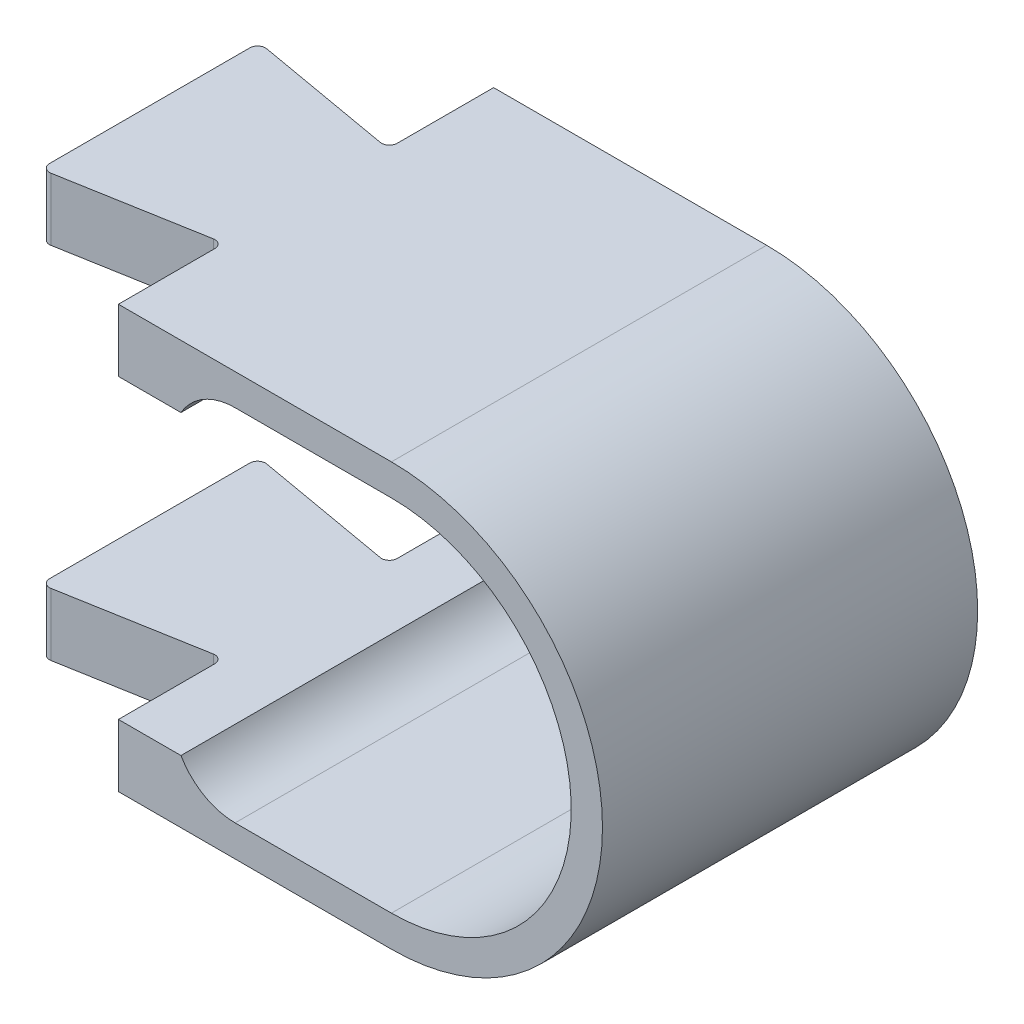
ISO-10303-21;
HEADER;
FILE_DESCRIPTION(('STEP AP214'),'2;1');
FILE_NAME('part.step','',(''),(''),'','','');
FILE_SCHEMA(('AUTOMOTIVE_DESIGN { 1 0 10303 214 1 1 1 1 }'));
ENDSEC;
DATA;
#1=APPLICATION_CONTEXT('core data for automotive mechanical design processes');
#2=APPLICATION_PROTOCOL_DEFINITION('international standard','automotive_design',2000,#1);
#3=PRODUCT_CONTEXT('',#1,'mechanical');
#4=PRODUCT('Part','Part','',(#3));
#5=PRODUCT_RELATED_PRODUCT_CATEGORY('part','',(#4));
#6=PRODUCT_DEFINITION_FORMATION('','',#4);
#7=PRODUCT_DEFINITION_CONTEXT('part definition',#1,'design');
#8=PRODUCT_DEFINITION('design','',#6,#7);
#9=PRODUCT_DEFINITION_SHAPE('','',#8);
#10=(LENGTH_UNIT() NAMED_UNIT(*) SI_UNIT(.MILLI.,.METRE.));
#11=(NAMED_UNIT(*) PLANE_ANGLE_UNIT() SI_UNIT($,.RADIAN.));
#12=(NAMED_UNIT(*) SI_UNIT($,.STERADIAN.) SOLID_ANGLE_UNIT());
#13=UNCERTAINTY_MEASURE_WITH_UNIT(LENGTH_MEASURE(1.E-05),#10,'distance_accuracy_value','');
#14=(GEOMETRIC_REPRESENTATION_CONTEXT(3) GLOBAL_UNCERTAINTY_ASSIGNED_CONTEXT((#13)) GLOBAL_UNIT_ASSIGNED_CONTEXT((#10,
#11,#12)) REPRESENTATION_CONTEXT('',''));
#15=CARTESIAN_POINT('',(0.,0.,0.));
#16=DIRECTION('',(0.,0.,1.));
#17=DIRECTION('',(1.,0.,0.));
#18=AXIS2_PLACEMENT_3D('',#15,#16,#17);
#19=CARTESIAN_POINT('',(0.,2.,0.));
#20=DIRECTION('',(0.,-1.,0.));
#21=DIRECTION('',(0.,0.,-1.));
#22=AXIS2_PLACEMENT_3D('',#19,#20,#21);
#23=PLANE('',#22);
#24=DIRECTION('',(1.,0.,0.));
#25=VECTOR('',#24,1.);
#26=CARTESIAN_POINT('',(-15.,2.,6.));
#27=LINE('',#26,#25);
#28=CARTESIAN_POINT('',(-15.,2.,6.));
#29=VERTEX_POINT('',#28);
#30=CARTESIAN_POINT('',(-13.,2.,6.));
#31=VERTEX_POINT('',#30);
#32=EDGE_CURVE('E364',#29,#31,#27,.T.);
#33=ORIENTED_EDGE('',*,*,#32,.T.);
#34=DIRECTION('',(0.,0.,1.));
#35=VECTOR('',#34,1.);
#36=CARTESIAN_POINT('',(-13.,2.,-6.));
#37=LINE('',#36,#35);
#38=CARTESIAN_POINT('',(-13.,2.,-6.));
#39=VERTEX_POINT('',#38);
#40=EDGE_CURVE('E346',#39,#31,#37,.T.);
#41=ORIENTED_EDGE('',*,*,#40,.F.);
#42=DIRECTION('',(-1.,0.,0.));
#43=VECTOR('',#42,1.);
#44=CARTESIAN_POINT('',(-15.,2.,-6.));
#45=LINE('',#44,#43);
#46=CARTESIAN_POINT('',(-15.,2.,-6.));
#47=VERTEX_POINT('',#46);
#48=EDGE_CURVE('E350',#39,#47,#45,.T.);
#49=ORIENTED_EDGE('',*,*,#48,.T.);
#50=DIRECTION('',(0.,0.,1.));
#51=VECTOR('',#50,1.);
#52=CARTESIAN_POINT('',(-15.,2.,-2.61836509645765));
#53=LINE('',#52,#51);
#54=CARTESIAN_POINT('',(-15.,2.,-2.91630349460621));
#55=VERTEX_POINT('',#54);
#56=EDGE_CURVE('E352',#47,#55,#53,.T.);
#57=ORIENTED_EDGE('',*,*,#56,.T.);
#58=CARTESIAN_POINT('',(-15.25,2.,-2.91630349460621));
#59=DIRECTION('',(0.,-1.,0.));
#60=DIRECTION('',(0.,0.,-1.));
#61=AXIS2_PLACEMENT_3D('',#58,#59,#60);
#62=CIRCLE('',#61,0.25);
#63=CARTESIAN_POINT('',(-15.2934120444167,2.,-2.67010155635316));
#64=VERTEX_POINT('',#63);
#65=EDGE_CURVE('E63',#55,#64,#62,.T.);
#66=ORIENTED_EDGE('',*,*,#65,.T.);
#67=DIRECTION('',(-0.984807753012207,0.,-0.173648177666934));
#68=VECTOR('',#67,1.);
#69=CARTESIAN_POINT('',(-15.,2.,-2.61836509645765));
#70=LINE('',#69,#68);
#71=CARTESIAN_POINT('',(-19.7065879555833,2.,-3.4482635401045));
#72=VERTEX_POINT('',#71);
#73=EDGE_CURVE('E354',#64,#72,#70,.T.);
#74=ORIENTED_EDGE('',*,*,#73,.T.);
#75=CARTESIAN_POINT('',(-19.75,2.,-3.20206160185145));
#76=DIRECTION('',(0.,-1.,0.));
#77=DIRECTION('',(0.,0.,-1.));
#78=AXIS2_PLACEMENT_3D('',#75,#76,#77);
#79=CIRCLE('',#78,0.25);
#80=CARTESIAN_POINT('',(-20.,2.,-3.20206160185145));
#81=VERTEX_POINT('',#80);
#82=EDGE_CURVE('E404',#72,#81,#79,.F.);
#83=ORIENTED_EDGE('',*,*,#82,.T.);
#84=DIRECTION('',(0.,0.,1.));
#85=VECTOR('',#84,1.);
#86=CARTESIAN_POINT('',(-20.,2.,-3.5));
#87=LINE('',#86,#85);
#88=CARTESIAN_POINT('',(-20.,2.,3.20206160185145));
#89=VERTEX_POINT('',#88);
#90=EDGE_CURVE('E356',#81,#89,#87,.T.);
#91=ORIENTED_EDGE('',*,*,#90,.T.);
#92=CARTESIAN_POINT('',(-19.75,2.,3.20206160185145));
#93=DIRECTION('',(0.,-1.,0.));
#94=DIRECTION('',(0.,0.,-1.));
#95=AXIS2_PLACEMENT_3D('',#92,#93,#94);
#96=CIRCLE('',#95,0.25);
#97=CARTESIAN_POINT('',(-19.7065879555833,2.,3.4482635401045));
#98=VERTEX_POINT('',#97);
#99=EDGE_CURVE('E406',#89,#98,#96,.F.);
#100=ORIENTED_EDGE('',*,*,#99,.T.);
#101=DIRECTION('',(0.984807753012207,0.,-0.173648177666935));
#102=VECTOR('',#101,1.);
#103=CARTESIAN_POINT('',(-15.,2.,2.61836509645765));
#104=LINE('',#103,#102);
#105=CARTESIAN_POINT('',(-15.2934120444167,2.,2.67010155635316));
#106=VERTEX_POINT('',#105);
#107=EDGE_CURVE('E359',#98,#106,#104,.T.);
#108=ORIENTED_EDGE('',*,*,#107,.T.);
#109=CARTESIAN_POINT('',(-15.25,2.,2.91630349460621));
#110=DIRECTION('',(0.,-1.,0.));
#111=DIRECTION('',(0.,0.,-1.));
#112=AXIS2_PLACEMENT_3D('',#109,#110,#111);
#113=CIRCLE('',#112,0.25);
#114=CARTESIAN_POINT('',(-15.,2.,2.91630349460621));
#115=VERTEX_POINT('',#114);
#116=EDGE_CURVE('E416',#106,#115,#113,.T.);
#117=ORIENTED_EDGE('',*,*,#116,.T.);
#118=DIRECTION('',(0.,0.,1.));
#119=VECTOR('',#118,1.);
#120=CARTESIAN_POINT('',(-15.,2.,6.));
#121=LINE('',#120,#119);
#122=EDGE_CURVE('E362',#115,#29,#121,.T.);
#123=ORIENTED_EDGE('',*,*,#122,.T.);
#124=EDGE_LOOP('',(#33,#41,#49,#57,#66,#74,#83,#91,#100,#108,#117,#123));
#125=FACE_BOUND('',#124,.T.);
#126=ADVANCED_FACE('F41',(#125),#23,.F.);
#127=CARTESIAN_POINT('',(-15.,2.,-6.));
#128=DIRECTION('',(0.,0.,1.));
#129=DIRECTION('',(1.,0.,0.));
#130=AXIS2_PLACEMENT_3D('',#127,#128,#129);
#131=PLANE('',#130);
#132=CARTESIAN_POINT('',(-11.2679491924311,3.,-6.));
#133=DIRECTION('',(0.,0.,1.));
#134=DIRECTION('',(1.,0.,0.));
#135=AXIS2_PLACEMENT_3D('',#132,#133,#134);
#136=CIRCLE('',#135,2.);
#137=CARTESIAN_POINT('',(-11.2679491924311,1.,-6.));
#138=VERTEX_POINT('',#137);
#139=EDGE_CURVE('E11',#39,#138,#136,.T.);
#140=ORIENTED_EDGE('',*,*,#139,.T.);
#141=DIRECTION('',(-1.,0.,0.));
#142=VECTOR('',#141,1.);
#143=CARTESIAN_POINT('',(-11.2679491924311,1.,-6.));
#144=LINE('',#143,#142);
#145=CARTESIAN_POINT('',(-6.26794919243112,1.,-6.));
#146=VERTEX_POINT('',#145);
#147=EDGE_CURVE('E246',#146,#138,#144,.T.);
#148=ORIENTED_EDGE('',*,*,#147,.F.);
#149=CARTESIAN_POINT('',(-6.26794919243112,6.75,-6.));
#150=DIRECTION('',(0.,0.,-1.));
#151=DIRECTION('',(1.,0.,0.));
#152=AXIS2_PLACEMENT_3D('',#149,#150,#151);
#153=CIRCLE('',#152,5.75);
#154=CARTESIAN_POINT('',(-6.26794919243112,12.5,-6.));
#155=VERTEX_POINT('',#154);
#156=EDGE_CURVE('E338',#155,#146,#153,.T.);
#157=ORIENTED_EDGE('',*,*,#156,.F.);
#158=DIRECTION('',(-1.,0.,0.));
#159=VECTOR('',#158,1.);
#160=CARTESIAN_POINT('',(-11.2679491924311,12.5,-6.));
#161=LINE('',#160,#159);
#162=CARTESIAN_POINT('',(-11.2679491924311,12.5,-6.));
#163=VERTEX_POINT('',#162);
#164=EDGE_CURVE('E522',#155,#163,#161,.T.);
#165=ORIENTED_EDGE('',*,*,#164,.T.);
#166=CARTESIAN_POINT('',(-11.2679491924311,10.5,-6.));
#167=DIRECTION('',(0.,0.,-1.));
#168=DIRECTION('',(1.,0.,0.));
#169=AXIS2_PLACEMENT_3D('',#166,#167,#168);
#170=CIRCLE('',#169,2.);
#171=CARTESIAN_POINT('',(-13.,11.5,-6.));
#172=VERTEX_POINT('',#171);
#173=EDGE_CURVE('E327',#172,#163,#170,.T.);
#174=ORIENTED_EDGE('',*,*,#173,.F.);
#175=DIRECTION('',(-1.,0.,0.));
#176=VECTOR('',#175,1.);
#177=CARTESIAN_POINT('',(-15.,11.5,-6.));
#178=LINE('',#177,#176);
#179=CARTESIAN_POINT('',(-15.,11.5,-6.));
#180=VERTEX_POINT('',#179);
#181=EDGE_CURVE('E265',#172,#180,#178,.T.);
#182=ORIENTED_EDGE('',*,*,#181,.T.);
#183=DIRECTION('',(0.,1.,0.));
#184=VECTOR('',#183,1.);
#185=CARTESIAN_POINT('',(-15.,11.5,-6.));
#186=LINE('',#185,#184);
#187=CARTESIAN_POINT('',(-15.,13.5,-6.));
#188=VERTEX_POINT('',#187);
#189=EDGE_CURVE('E277',#180,#188,#186,.T.);
#190=ORIENTED_EDGE('',*,*,#189,.T.);
#191=DIRECTION('',(-1.,0.,0.));
#192=VECTOR('',#191,1.);
#193=CARTESIAN_POINT('',(-15.,13.5,-6.));
#194=LINE('',#193,#192);
#195=CARTESIAN_POINT('',(-6.26794919243112,13.5,-6.));
#196=VERTEX_POINT('',#195);
#197=EDGE_CURVE('E471',#196,#188,#194,.T.);
#198=ORIENTED_EDGE('',*,*,#197,.F.);
#199=CARTESIAN_POINT('',(-6.26794919243112,6.75,-6.));
#200=DIRECTION('',(0.,0.,1.));
#201=DIRECTION('',(1.,0.,0.));
#202=AXIS2_PLACEMENT_3D('',#199,#200,#201);
#203=CIRCLE('',#202,6.75);
#204=CARTESIAN_POINT('',(-6.26794919243112,0.,-6.));
#205=VERTEX_POINT('',#204);
#206=EDGE_CURVE('E252',#205,#196,#203,.T.);
#207=ORIENTED_EDGE('',*,*,#206,.F.);
#208=DIRECTION('',(-1.,0.,0.));
#209=VECTOR('',#208,1.);
#210=CARTESIAN_POINT('',(-15.,0.,-6.));
#211=LINE('',#210,#209);
#212=CARTESIAN_POINT('',(-15.,0.,-6.));
#213=VERTEX_POINT('',#212);
#214=EDGE_CURVE('E349',#205,#213,#211,.T.);
#215=ORIENTED_EDGE('',*,*,#214,.T.);
#216=DIRECTION('',(0.,-1.,0.));
#217=VECTOR('',#216,1.);
#218=CARTESIAN_POINT('',(-15.,2.,-6.));
#219=LINE('',#218,#217);
#220=EDGE_CURVE('E384',#47,#213,#219,.T.);
#221=ORIENTED_EDGE('',*,*,#220,.F.);
#222=ORIENTED_EDGE('',*,*,#48,.F.);
#223=EDGE_LOOP('',(#140,#148,#157,#165,#174,#182,#190,#198,#207,#215,#221,#222));
#224=FACE_BOUND('',#223,.T.);
#225=ADVANCED_FACE('F433',(#224),#131,.F.);
#226=CARTESIAN_POINT('',(-15.,2.,-2.61836509645765));
#227=DIRECTION('',(1.,0.,0.));
#228=DIRECTION('',(0.,0.,-1.));
#229=AXIS2_PLACEMENT_3D('',#226,#227,#228);
#230=PLANE('',#229);
#231=DIRECTION('',(0.,0.,1.));
#232=VECTOR('',#231,1.);
#233=CARTESIAN_POINT('',(-15.,0.,-2.61836509645765));
#234=LINE('',#233,#232);
#235=CARTESIAN_POINT('',(-15.,0.,-2.91630349460621));
#236=VERTEX_POINT('',#235);
#237=EDGE_CURVE('E369',#213,#236,#234,.T.);
#238=ORIENTED_EDGE('',*,*,#237,.T.);
#239=DIRECTION('',(0.,-1.,0.));
#240=VECTOR('',#239,1.);
#241=CARTESIAN_POINT('',(-15.,2.,-2.91630349460621));
#242=LINE('',#241,#240);
#243=EDGE_CURVE('E412',#236,#55,#242,.F.);
#244=ORIENTED_EDGE('',*,*,#243,.T.);
#245=ORIENTED_EDGE('',*,*,#56,.F.);
#246=ORIENTED_EDGE('',*,*,#220,.T.);
#247=EDGE_LOOP('',(#238,#244,#245,#246));
#248=FACE_BOUND('',#247,.T.);
#249=ADVANCED_FACE('F552',(#248),#230,.F.);
#250=CARTESIAN_POINT('',(-15.,2.,-2.61836509645765));
#251=DIRECTION('',(-0.173648177666934,0.,0.984807753012207));
#252=DIRECTION('',(0.984807753012208,0.,0.173648177666934));
#253=AXIS2_PLACEMENT_3D('',#250,#251,#252);
#254=PLANE('',#253);
#255=DIRECTION('',(-0.984807753012207,0.,-0.173648177666934));
#256=VECTOR('',#255,1.);
#257=CARTESIAN_POINT('',(-15.,0.,-2.61836509645765));
#258=LINE('',#257,#256);
#259=CARTESIAN_POINT('',(-15.2934120444167,0.,-2.67010155635316));
#260=VERTEX_POINT('',#259);
#261=CARTESIAN_POINT('',(-19.7065879555833,0.,-3.4482635401045));
#262=VERTEX_POINT('',#261);
#263=EDGE_CURVE('E372',#260,#262,#258,.T.);
#264=ORIENTED_EDGE('',*,*,#263,.T.);
#265=DIRECTION('',(0.,-1.,0.));
#266=VECTOR('',#265,1.);
#267=CARTESIAN_POINT('',(-19.7065879555833,2.,-3.4482635401045));
#268=LINE('',#267,#266);
#269=EDGE_CURVE('E56',#262,#72,#268,.F.);
#270=ORIENTED_EDGE('',*,*,#269,.T.);
#271=ORIENTED_EDGE('',*,*,#73,.F.);
#272=DIRECTION('',(0.,-1.,0.));
#273=VECTOR('',#272,1.);
#274=CARTESIAN_POINT('',(-15.2934120444167,0.,-2.67010155635316));
#275=LINE('',#274,#273);
#276=EDGE_CURVE('E408',#64,#260,#275,.T.);
#277=ORIENTED_EDGE('',*,*,#276,.T.);
#278=EDGE_LOOP('',(#264,#270,#271,#277));
#279=FACE_BOUND('',#278,.T.);
#280=ADVANCED_FACE('F442',(#279),#254,.F.);
#281=CARTESIAN_POINT('',(-20.,2.,-3.5));
#282=DIRECTION('',(1.,0.,0.));
#283=DIRECTION('',(0.,0.,-1.));
#284=AXIS2_PLACEMENT_3D('',#281,#282,#283);
#285=PLANE('',#284);
#286=DIRECTION('',(0.,0.,1.));
#287=VECTOR('',#286,1.);
#288=CARTESIAN_POINT('',(-20.,0.,-3.5));
#289=LINE('',#288,#287);
#290=CARTESIAN_POINT('',(-20.,0.,-3.20206160185145));
#291=VERTEX_POINT('',#290);
#292=CARTESIAN_POINT('',(-20.,0.,3.20206160185145));
#293=VERTEX_POINT('',#292);
#294=EDGE_CURVE('E374',#291,#293,#289,.T.);
#295=ORIENTED_EDGE('',*,*,#294,.T.);
#296=DIRECTION('',(0.,-1.,0.));
#297=VECTOR('',#296,1.);
#298=CARTESIAN_POINT('',(-20.,2.,3.20206160185145));
#299=LINE('',#298,#297);
#300=EDGE_CURVE('E402',#293,#89,#299,.F.);
#301=ORIENTED_EDGE('',*,*,#300,.T.);
#302=ORIENTED_EDGE('',*,*,#90,.F.);
#303=DIRECTION('',(0.,-1.,0.));
#304=VECTOR('',#303,1.);
#305=CARTESIAN_POINT('',(-20.,2.,-3.20206160185145));
#306=LINE('',#305,#304);
#307=EDGE_CURVE('E399',#81,#291,#306,.T.);
#308=ORIENTED_EDGE('',*,*,#307,.T.);
#309=EDGE_LOOP('',(#295,#301,#302,#308));
#310=FACE_BOUND('',#309,.T.);
#311=ADVANCED_FACE('F453',(#310),#285,.F.);
#312=CARTESIAN_POINT('',(-15.,2.,2.61836509645765));
#313=DIRECTION('',(-0.173648177666935,0.,-0.984807753012207));
#314=DIRECTION('',(-0.984807753012207,0.,0.173648177666935));
#315=AXIS2_PLACEMENT_3D('',#312,#313,#314);
#316=PLANE('',#315);
#317=DIRECTION('',(0.984807753012207,0.,-0.173648177666935));
#318=VECTOR('',#317,1.);
#319=CARTESIAN_POINT('',(-15.,0.,2.61836509645765));
#320=LINE('',#319,#318);
#321=CARTESIAN_POINT('',(-19.7065879555833,0.,3.4482635401045));
#322=VERTEX_POINT('',#321);
#323=CARTESIAN_POINT('',(-15.2934120444167,0.,2.67010155635316));
#324=VERTEX_POINT('',#323);
#325=EDGE_CURVE('E377',#322,#324,#320,.T.);
#326=ORIENTED_EDGE('',*,*,#325,.T.);
#327=DIRECTION('',(0.,-1.,0.));
#328=VECTOR('',#327,1.);
#329=CARTESIAN_POINT('',(-15.2934120444167,2.,2.67010155635316));
#330=LINE('',#329,#328);
#331=EDGE_CURVE('E393',#324,#106,#330,.F.);
#332=ORIENTED_EDGE('',*,*,#331,.T.);
#333=ORIENTED_EDGE('',*,*,#107,.F.);
#334=DIRECTION('',(0.,-1.,0.));
#335=VECTOR('',#334,1.);
#336=CARTESIAN_POINT('',(-19.7065879555833,2.,3.4482635401045));
#337=LINE('',#336,#335);
#338=EDGE_CURVE('E390',#98,#322,#337,.T.);
#339=ORIENTED_EDGE('',*,*,#338,.T.);
#340=EDGE_LOOP('',(#326,#332,#333,#339));
#341=FACE_BOUND('',#340,.T.);
#342=ADVANCED_FACE('F462',(#341),#316,.F.);
#343=CARTESIAN_POINT('',(-15.,2.,6.));
#344=DIRECTION('',(1.,0.,0.));
#345=DIRECTION('',(0.,0.,-1.));
#346=AXIS2_PLACEMENT_3D('',#343,#344,#345);
#347=PLANE('',#346);
#348=ORIENTED_EDGE('',*,*,#122,.F.);
#349=DIRECTION('',(0.,-1.,0.));
#350=VECTOR('',#349,1.);
#351=CARTESIAN_POINT('',(-15.,0.,2.91630349460621));
#352=LINE('',#351,#350);
#353=CARTESIAN_POINT('',(-15.,0.,2.91630349460621));
#354=VERTEX_POINT('',#353);
#355=EDGE_CURVE('E387',#115,#354,#352,.T.);
#356=ORIENTED_EDGE('',*,*,#355,.T.);
#357=DIRECTION('',(0.,0.,1.));
#358=VECTOR('',#357,1.);
#359=CARTESIAN_POINT('',(-15.,0.,6.));
#360=LINE('',#359,#358);
#361=CARTESIAN_POINT('',(-15.,0.,6.));
#362=VERTEX_POINT('',#361);
#363=EDGE_CURVE('E380',#354,#362,#360,.T.);
#364=ORIENTED_EDGE('',*,*,#363,.T.);
#365=DIRECTION('',(0.,-1.,0.));
#366=VECTOR('',#365,1.);
#367=CARTESIAN_POINT('',(-15.,2.,6.));
#368=LINE('',#367,#366);
#369=EDGE_CURVE('E367',#29,#362,#368,.T.);
#370=ORIENTED_EDGE('',*,*,#369,.F.);
#371=EDGE_LOOP('',(#348,#356,#364,#370));
#372=FACE_BOUND('',#371,.T.);
#373=ADVANCED_FACE('F470',(#372),#347,.F.);
#374=CARTESIAN_POINT('',(-15.,2.,6.));
#375=DIRECTION('',(0.,0.,-1.));
#376=DIRECTION('',(-1.,0.,0.));
#377=AXIS2_PLACEMENT_3D('',#374,#375,#376);
#378=PLANE('',#377);
#379=DIRECTION('',(1.,0.,0.));
#380=VECTOR('',#379,1.);
#381=CARTESIAN_POINT('',(-15.,0.,6.));
#382=LINE('',#381,#380);
#383=CARTESIAN_POINT('',(-6.26794919243112,0.,6.));
#384=VERTEX_POINT('',#383);
#385=EDGE_CURVE('E240',#362,#384,#382,.T.);
#386=ORIENTED_EDGE('',*,*,#385,.T.);
#387=CARTESIAN_POINT('',(-6.26794919243112,6.75,6.));
#388=DIRECTION('',(0.,0.,1.));
#389=DIRECTION('',(1.,0.,0.));
#390=AXIS2_PLACEMENT_3D('',#387,#388,#389);
#391=CIRCLE('',#390,6.75);
#392=CARTESIAN_POINT('',(-6.26794919243112,13.5,6.));
#393=VERTEX_POINT('',#392);
#394=EDGE_CURVE('E232',#384,#393,#391,.T.);
#395=ORIENTED_EDGE('',*,*,#394,.T.);
#396=DIRECTION('',(1.,0.,0.));
#397=VECTOR('',#396,1.);
#398=CARTESIAN_POINT('',(-15.,13.5,6.));
#399=LINE('',#398,#397);
#400=CARTESIAN_POINT('',(-15.,13.5,6.));
#401=VERTEX_POINT('',#400);
#402=EDGE_CURVE('E236',#401,#393,#399,.T.);
#403=ORIENTED_EDGE('',*,*,#402,.F.);
#404=DIRECTION('',(0.,1.,0.));
#405=VECTOR('',#404,1.);
#406=CARTESIAN_POINT('',(-15.,11.5,6.));
#407=LINE('',#406,#405);
#408=CARTESIAN_POINT('',(-15.,11.5,6.));
#409=VERTEX_POINT('',#408);
#410=EDGE_CURVE('E275',#409,#401,#407,.T.);
#411=ORIENTED_EDGE('',*,*,#410,.F.);
#412=DIRECTION('',(1.,0.,0.));
#413=VECTOR('',#412,1.);
#414=CARTESIAN_POINT('',(-15.,11.5,6.));
#415=LINE('',#414,#413);
#416=CARTESIAN_POINT('',(-13.,11.5,6.));
#417=VERTEX_POINT('',#416);
#418=EDGE_CURVE('E278',#409,#417,#415,.T.);
#419=ORIENTED_EDGE('',*,*,#418,.T.);
#420=CARTESIAN_POINT('',(-11.2679491924311,10.5,6.));
#421=DIRECTION('',(0.,0.,1.));
#422=DIRECTION('',(-1.,0.,0.));
#423=AXIS2_PLACEMENT_3D('',#420,#421,#422);
#424=CIRCLE('',#423,2.);
#425=CARTESIAN_POINT('',(-11.2679491924311,12.5,6.));
#426=VERTEX_POINT('',#425);
#427=EDGE_CURVE('E324',#426,#417,#424,.T.);
#428=ORIENTED_EDGE('',*,*,#427,.F.);
#429=DIRECTION('',(-1.,0.,0.));
#430=VECTOR('',#429,1.);
#431=CARTESIAN_POINT('',(-11.2679491924311,12.5,6.));
#432=LINE('',#431,#430);
#433=CARTESIAN_POINT('',(-6.26794919243112,12.5,6.));
#434=VERTEX_POINT('',#433);
#435=EDGE_CURVE('E521',#434,#426,#432,.T.);
#436=ORIENTED_EDGE('',*,*,#435,.F.);
#437=CARTESIAN_POINT('',(-6.26794919243112,6.75,6.));
#438=DIRECTION('',(0.,0.,-1.));
#439=DIRECTION('',(1.,0.,0.));
#440=AXIS2_PLACEMENT_3D('',#437,#438,#439);
#441=CIRCLE('',#440,5.75);
#442=CARTESIAN_POINT('',(-6.26794919243112,1.,6.));
#443=VERTEX_POINT('',#442);
#444=EDGE_CURVE('E245',#434,#443,#441,.T.);
#445=ORIENTED_EDGE('',*,*,#444,.T.);
#446=DIRECTION('',(-1.,0.,0.));
#447=VECTOR('',#446,1.);
#448=CARTESIAN_POINT('',(-11.2679491924311,1.,6.));
#449=LINE('',#448,#447);
#450=CARTESIAN_POINT('',(-11.2679491924311,1.,6.));
#451=VERTEX_POINT('',#450);
#452=EDGE_CURVE('E332',#443,#451,#449,.T.);
#453=ORIENTED_EDGE('',*,*,#452,.T.);
#454=CARTESIAN_POINT('',(-11.2679491924311,3.,6.));
#455=DIRECTION('',(0.,0.,-1.));
#456=DIRECTION('',(-1.,0.,0.));
#457=AXIS2_PLACEMENT_3D('',#454,#455,#456);
#458=CIRCLE('',#457,2.);
#459=EDGE_CURVE('E49',#451,#31,#458,.T.);
#460=ORIENTED_EDGE('',*,*,#459,.T.);
#461=ORIENTED_EDGE('',*,*,#32,.F.);
#462=ORIENTED_EDGE('',*,*,#369,.T.);
#463=EDGE_LOOP('',(#386,#395,#403,#411,#419,#428,#436,#445,#453,#460,#461,#462));
#464=FACE_BOUND('',#463,.T.);
#465=ADVANCED_FACE('F234',(#464),#378,.F.);
#466=CARTESIAN_POINT('',(0.,0.,0.));
#467=DIRECTION('',(0.,-1.,0.));
#468=DIRECTION('',(0.,0.,-1.));
#469=AXIS2_PLACEMENT_3D('',#466,#467,#468);
#470=PLANE('',#469);
#471=ORIENTED_EDGE('',*,*,#214,.F.);
#472=DIRECTION('',(0.,0.,-1.));
#473=VECTOR('',#472,1.);
#474=CARTESIAN_POINT('',(-6.26794919243112,0.,6.));
#475=LINE('',#474,#473);
#476=EDGE_CURVE('E344',#384,#205,#475,.T.);
#477=ORIENTED_EDGE('',*,*,#476,.F.);
#478=ORIENTED_EDGE('',*,*,#385,.F.);
#479=ORIENTED_EDGE('',*,*,#363,.F.);
#480=CARTESIAN_POINT('',(-15.25,0.,2.91630349460621));
#481=DIRECTION('',(0.,-1.,0.));
#482=DIRECTION('',(0.,0.,-1.));
#483=AXIS2_PLACEMENT_3D('',#480,#481,#482);
#484=CIRCLE('',#483,0.25);
#485=EDGE_CURVE('E414',#354,#324,#484,.F.);
#486=ORIENTED_EDGE('',*,*,#485,.T.);
#487=ORIENTED_EDGE('',*,*,#325,.F.);
#488=CARTESIAN_POINT('',(-19.75,0.,3.20206160185145));
#489=DIRECTION('',(0.,-1.,0.));
#490=DIRECTION('',(0.,0.,-1.));
#491=AXIS2_PLACEMENT_3D('',#488,#489,#490);
#492=CIRCLE('',#491,0.25);
#493=EDGE_CURVE('E397',#322,#293,#492,.T.);
#494=ORIENTED_EDGE('',*,*,#493,.T.);
#495=ORIENTED_EDGE('',*,*,#294,.F.);
#496=CARTESIAN_POINT('',(-19.75,0.,-3.20206160185145));
#497=DIRECTION('',(0.,-1.,0.));
#498=DIRECTION('',(0.,0.,-1.));
#499=AXIS2_PLACEMENT_3D('',#496,#497,#498);
#500=CIRCLE('',#499,0.25);
#501=EDGE_CURVE('E395',#291,#262,#500,.T.);
#502=ORIENTED_EDGE('',*,*,#501,.T.);
#503=ORIENTED_EDGE('',*,*,#263,.F.);
#504=CARTESIAN_POINT('',(-15.25,0.,-2.91630349460621));
#505=DIRECTION('',(0.,-1.,0.));
#506=DIRECTION('',(0.,0.,-1.));
#507=AXIS2_PLACEMENT_3D('',#504,#505,#506);
#508=CIRCLE('',#507,0.25);
#509=EDGE_CURVE('E418',#260,#236,#508,.F.);
#510=ORIENTED_EDGE('',*,*,#509,.T.);
#511=ORIENTED_EDGE('',*,*,#237,.F.);
#512=EDGE_LOOP('',(#471,#477,#478,#479,#486,#487,#494,#495,#502,#503,#510,#511));
#513=FACE_BOUND('',#512,.T.);
#514=ADVANCED_FACE('F444',(#513),#470,.T.);
#515=CARTESIAN_POINT('',(-15.25,2.,2.91630349460621));
#516=DIRECTION('',(0.,1.,0.));
#517=DIRECTION('',(0.,0.,1.));
#518=AXIS2_PLACEMENT_3D('',#515,#516,#517);
#519=CYLINDRICAL_SURFACE('',#518,0.25);
#520=ORIENTED_EDGE('',*,*,#116,.F.);
#521=ORIENTED_EDGE('',*,*,#331,.F.);
#522=ORIENTED_EDGE('',*,*,#485,.F.);
#523=ORIENTED_EDGE('',*,*,#355,.F.);
#524=EDGE_LOOP('',(#520,#521,#522,#523));
#525=FACE_BOUND('',#524,.T.);
#526=ADVANCED_FACE('F468',(#525),#519,.F.);
#527=CARTESIAN_POINT('',(-19.75,2.,3.20206160185145));
#528=DIRECTION('',(0.,-1.,0.));
#529=DIRECTION('',(0.,0.,-1.));
#530=AXIS2_PLACEMENT_3D('',#527,#528,#529);
#531=CYLINDRICAL_SURFACE('',#530,0.25);
#532=ORIENTED_EDGE('',*,*,#99,.F.);
#533=ORIENTED_EDGE('',*,*,#300,.F.);
#534=ORIENTED_EDGE('',*,*,#493,.F.);
#535=ORIENTED_EDGE('',*,*,#338,.F.);
#536=EDGE_LOOP('',(#532,#533,#534,#535));
#537=FACE_BOUND('',#536,.T.);
#538=ADVANCED_FACE('F459',(#537),#531,.T.);
#539=CARTESIAN_POINT('',(-19.75,2.,-3.20206160185145));
#540=DIRECTION('',(0.,-1.,0.));
#541=DIRECTION('',(0.,0.,-1.));
#542=AXIS2_PLACEMENT_3D('',#539,#540,#541);
#543=CYLINDRICAL_SURFACE('',#542,0.25);
#544=ORIENTED_EDGE('',*,*,#82,.F.);
#545=ORIENTED_EDGE('',*,*,#269,.F.);
#546=ORIENTED_EDGE('',*,*,#501,.F.);
#547=ORIENTED_EDGE('',*,*,#307,.F.);
#548=EDGE_LOOP('',(#544,#545,#546,#547));
#549=FACE_BOUND('',#548,.T.);
#550=ADVANCED_FACE('F450',(#549),#543,.T.);
#551=CARTESIAN_POINT('',(-15.25,2.,-2.91630349460621));
#552=DIRECTION('',(0.,1.,0.));
#553=DIRECTION('',(0.,0.,1.));
#554=AXIS2_PLACEMENT_3D('',#551,#552,#553);
#555=CYLINDRICAL_SURFACE('',#554,0.25);
#556=ORIENTED_EDGE('',*,*,#65,.F.);
#557=ORIENTED_EDGE('',*,*,#243,.F.);
#558=ORIENTED_EDGE('',*,*,#509,.F.);
#559=ORIENTED_EDGE('',*,*,#276,.F.);
#560=EDGE_LOOP('',(#556,#557,#558,#559));
#561=FACE_BOUND('',#560,.T.);
#562=ADVANCED_FACE('F440',(#561),#555,.F.);
#563=CARTESIAN_POINT('',(-11.2679491924311,3.,-6.));
#564=DIRECTION('',(0.,0.,1.));
#565=DIRECTION('',(1.,0.,0.));
#566=AXIS2_PLACEMENT_3D('',#563,#564,#565);
#567=CYLINDRICAL_SURFACE('',#566,2.);
#568=ORIENTED_EDGE('',*,*,#139,.F.);
#569=ORIENTED_EDGE('',*,*,#40,.T.);
#570=ORIENTED_EDGE('',*,*,#459,.F.);
#571=DIRECTION('',(0.,0.,-1.));
#572=VECTOR('',#571,1.);
#573=CARTESIAN_POINT('',(-11.2679491924311,1.,6.));
#574=LINE('',#573,#572);
#575=EDGE_CURVE('E421',#138,#451,#574,.F.);
#576=ORIENTED_EDGE('',*,*,#575,.F.);
#577=EDGE_LOOP('',(#568,#569,#570,#576));
#578=FACE_BOUND('',#577,.T.);
#579=ADVANCED_FACE('F43',(#578),#567,.F.);
#580=CARTESIAN_POINT('',(-6.26794919243112,6.75,6.));
#581=DIRECTION('',(0.,0.,-1.));
#582=DIRECTION('',(-1.,0.,0.));
#583=AXIS2_PLACEMENT_3D('',#580,#581,#582);
#584=CYLINDRICAL_SURFACE('',#583,6.75);
#585=ORIENTED_EDGE('',*,*,#206,.T.);
#586=DIRECTION('',(0.,0.,-1.));
#587=VECTOR('',#586,1.);
#588=CARTESIAN_POINT('',(-6.26794919243112,13.5,6.));
#589=LINE('',#588,#587);
#590=EDGE_CURVE('E249',#393,#196,#589,.T.);
#591=ORIENTED_EDGE('',*,*,#590,.F.);
#592=ORIENTED_EDGE('',*,*,#394,.F.);
#593=ORIENTED_EDGE('',*,*,#476,.T.);
#594=EDGE_LOOP('',(#585,#591,#592,#593));
#595=FACE_BOUND('',#594,.T.);
#596=ADVANCED_FACE('F250',(#595),#584,.T.);
#597=CARTESIAN_POINT('',(-6.26794919243112,6.75,6.));
#598=DIRECTION('',(0.,0.,-1.));
#599=DIRECTION('',(-1.,0.,0.));
#600=AXIS2_PLACEMENT_3D('',#597,#598,#599);
#601=CYLINDRICAL_SURFACE('',#600,5.75);
#602=ORIENTED_EDGE('',*,*,#156,.T.);
#603=DIRECTION('',(0.,0.,-1.));
#604=VECTOR('',#603,1.);
#605=CARTESIAN_POINT('',(-6.26794919243112,1.,6.));
#606=LINE('',#605,#604);
#607=EDGE_CURVE('E335',#443,#146,#606,.T.);
#608=ORIENTED_EDGE('',*,*,#607,.F.);
#609=ORIENTED_EDGE('',*,*,#444,.F.);
#610=DIRECTION('',(0.,0.,-1.));
#611=VECTOR('',#610,1.);
#612=CARTESIAN_POINT('',(-6.26794919243112,12.5,6.));
#613=LINE('',#612,#611);
#614=EDGE_CURVE('E258',#434,#155,#613,.T.);
#615=ORIENTED_EDGE('',*,*,#614,.T.);
#616=EDGE_LOOP('',(#602,#608,#609,#615));
#617=FACE_BOUND('',#616,.T.);
#618=ADVANCED_FACE('F533',(#617),#601,.F.);
#619=CARTESIAN_POINT('',(-11.2679491924311,1.,6.));
#620=DIRECTION('',(0.,-1.,0.));
#621=DIRECTION('',(0.,0.,-1.));
#622=AXIS2_PLACEMENT_3D('',#619,#620,#621);
#623=PLANE('',#622);
#624=ORIENTED_EDGE('',*,*,#147,.T.);
#625=ORIENTED_EDGE('',*,*,#575,.T.);
#626=ORIENTED_EDGE('',*,*,#452,.F.);
#627=ORIENTED_EDGE('',*,*,#607,.T.);
#628=EDGE_LOOP('',(#624,#625,#626,#627));
#629=FACE_BOUND('',#628,.T.);
#630=ADVANCED_FACE('F535',(#629),#623,.F.);
#631=CARTESIAN_POINT('',(0.,11.5,0.));
#632=DIRECTION('',(0.,1.,0.));
#633=DIRECTION('',(0.,0.,-1.));
#634=AXIS2_PLACEMENT_3D('',#631,#632,#633);
#635=PLANE('',#634);
#636=ORIENTED_EDGE('',*,*,#418,.F.);
#637=DIRECTION('',(0.,0.,1.));
#638=VECTOR('',#637,1.);
#639=CARTESIAN_POINT('',(-15.,11.5,6.));
#640=LINE('',#639,#638);
#641=CARTESIAN_POINT('',(-15.,11.5,2.91630349460621));
#642=VERTEX_POINT('',#641);
#643=EDGE_CURVE('E503',#642,#409,#640,.T.);
#644=ORIENTED_EDGE('',*,*,#643,.F.);
#645=CARTESIAN_POINT('',(-15.25,11.5,2.91630349460621));
#646=DIRECTION('',(0.,-1.,0.));
#647=DIRECTION('',(0.,0.,-1.));
#648=AXIS2_PLACEMENT_3D('',#645,#646,#647);
#649=CIRCLE('',#648,0.25);
#650=CARTESIAN_POINT('',(-15.2934120444167,11.5,2.67010155635316));
#651=VERTEX_POINT('',#650);
#652=EDGE_CURVE('E313',#651,#642,#649,.T.);
#653=ORIENTED_EDGE('',*,*,#652,.F.);
#654=DIRECTION('',(0.984807753012207,0.,-0.173648177666935));
#655=VECTOR('',#654,1.);
#656=CARTESIAN_POINT('',(-15.,11.5,2.61836509645765));
#657=LINE('',#656,#655);
#658=CARTESIAN_POINT('',(-19.7065879555833,11.5,3.4482635401045));
#659=VERTEX_POINT('',#658);
#660=EDGE_CURVE('E495',#659,#651,#657,.T.);
#661=ORIENTED_EDGE('',*,*,#660,.F.);
#662=CARTESIAN_POINT('',(-19.75,11.5,3.20206160185145));
#663=DIRECTION('',(0.,-1.,0.));
#664=DIRECTION('',(0.,0.,-1.));
#665=AXIS2_PLACEMENT_3D('',#662,#663,#664);
#666=CIRCLE('',#665,0.25);
#667=CARTESIAN_POINT('',(-20.,11.5,3.20206160185145));
#668=VERTEX_POINT('',#667);
#669=EDGE_CURVE('E301',#668,#659,#666,.F.);
#670=ORIENTED_EDGE('',*,*,#669,.F.);
#671=DIRECTION('',(0.,0.,1.));
#672=VECTOR('',#671,1.);
#673=CARTESIAN_POINT('',(-20.,11.5,-3.5));
#674=LINE('',#673,#672);
#675=CARTESIAN_POINT('',(-20.,11.5,-3.20206160185145));
#676=VERTEX_POINT('',#675);
#677=EDGE_CURVE('E509',#676,#668,#674,.T.);
#678=ORIENTED_EDGE('',*,*,#677,.F.);
#679=CARTESIAN_POINT('',(-19.75,11.5,-3.20206160185145));
#680=DIRECTION('',(0.,-1.,0.));
#681=DIRECTION('',(0.,0.,-1.));
#682=AXIS2_PLACEMENT_3D('',#679,#680,#681);
#683=CIRCLE('',#682,0.25);
#684=CARTESIAN_POINT('',(-19.7065879555833,11.5,-3.4482635401045));
#685=VERTEX_POINT('',#684);
#686=EDGE_CURVE('E298',#685,#676,#683,.F.);
#687=ORIENTED_EDGE('',*,*,#686,.F.);
#688=DIRECTION('',(-0.984807753012207,0.,-0.173648177666934));
#689=VECTOR('',#688,1.);
#690=CARTESIAN_POINT('',(-15.,11.5,-2.61836509645765));
#691=LINE('',#690,#689);
#692=CARTESIAN_POINT('',(-15.2934120444167,11.5,-2.67010155635316));
#693=VERTEX_POINT('',#692);
#694=EDGE_CURVE('E514',#693,#685,#691,.T.);
#695=ORIENTED_EDGE('',*,*,#694,.F.);
#696=CARTESIAN_POINT('',(-15.25,11.5,-2.91630349460621));
#697=DIRECTION('',(0.,-1.,0.));
#698=DIRECTION('',(0.,0.,-1.));
#699=AXIS2_PLACEMENT_3D('',#696,#697,#698);
#700=CIRCLE('',#699,0.25);
#701=CARTESIAN_POINT('',(-15.,11.5,-2.91630349460621));
#702=VERTEX_POINT('',#701);
#703=EDGE_CURVE('E318',#702,#693,#700,.T.);
#704=ORIENTED_EDGE('',*,*,#703,.F.);
#705=DIRECTION('',(0.,0.,1.));
#706=VECTOR('',#705,1.);
#707=CARTESIAN_POINT('',(-15.,11.5,-2.61836509645765));
#708=LINE('',#707,#706);
#709=EDGE_CURVE('E269',#180,#702,#708,.T.);
#710=ORIENTED_EDGE('',*,*,#709,.F.);
#711=ORIENTED_EDGE('',*,*,#181,.F.);
#712=DIRECTION('',(0.,0.,1.));
#713=VECTOR('',#712,1.);
#714=CARTESIAN_POINT('',(-13.,11.5,-6.));
#715=LINE('',#714,#713);
#716=EDGE_CURVE('E257',#172,#417,#715,.T.);
#717=ORIENTED_EDGE('',*,*,#716,.T.);
#718=EDGE_LOOP('',(#636,#644,#653,#661,#670,#678,#687,#695,#704,#710,#711,#717));
#719=FACE_BOUND('',#718,.T.);
#720=ADVANCED_FACE('F537',(#719),#635,.F.);
#721=CARTESIAN_POINT('',(-15.,11.5,-2.61836509645765));
#722=DIRECTION('',(1.,0.,0.));
#723=DIRECTION('',(0.,0.,-1.));
#724=AXIS2_PLACEMENT_3D('',#721,#722,#723);
#725=PLANE('',#724);
#726=DIRECTION('',(0.,0.,1.));
#727=VECTOR('',#726,1.);
#728=CARTESIAN_POINT('',(-15.,13.5,-2.61836509645765));
#729=LINE('',#728,#727);
#730=CARTESIAN_POINT('',(-15.,13.5,-2.91630349460621));
#731=VERTEX_POINT('',#730);
#732=EDGE_CURVE('E474',#188,#731,#729,.T.);
#733=ORIENTED_EDGE('',*,*,#732,.F.);
#734=ORIENTED_EDGE('',*,*,#189,.F.);
#735=ORIENTED_EDGE('',*,*,#709,.T.);
#736=DIRECTION('',(0.,1.,0.));
#737=VECTOR('',#736,1.);
#738=CARTESIAN_POINT('',(-15.,11.5,-2.91630349460621));
#739=LINE('',#738,#737);
#740=EDGE_CURVE('E309',#731,#702,#739,.F.);
#741=ORIENTED_EDGE('',*,*,#740,.F.);
#742=EDGE_LOOP('',(#733,#734,#735,#741));
#743=FACE_BOUND('',#742,.T.);
#744=ADVANCED_FACE('F543',(#743),#725,.F.);
#745=CARTESIAN_POINT('',(-15.,11.5,-2.61836509645765));
#746=DIRECTION('',(-0.173648177666934,0.,0.984807753012207));
#747=DIRECTION('',(0.984807753012208,0.,0.173648177666934));
#748=AXIS2_PLACEMENT_3D('',#745,#746,#747);
#749=PLANE('',#748);
#750=DIRECTION('',(-0.984807753012207,0.,-0.173648177666934));
#751=VECTOR('',#750,1.);
#752=CARTESIAN_POINT('',(-15.,13.5,-2.61836509645765));
#753=LINE('',#752,#751);
#754=CARTESIAN_POINT('',(-15.2934120444167,13.5,-2.67010155635316));
#755=VERTEX_POINT('',#754);
#756=CARTESIAN_POINT('',(-19.7065879555833,13.5,-3.4482635401045));
#757=VERTEX_POINT('',#756);
#758=EDGE_CURVE('E477',#755,#757,#753,.T.);
#759=ORIENTED_EDGE('',*,*,#758,.F.);
#760=DIRECTION('',(0.,1.,0.));
#761=VECTOR('',#760,1.);
#762=CARTESIAN_POINT('',(-15.2934120444167,13.5,-2.67010155635316));
#763=LINE('',#762,#761);
#764=EDGE_CURVE('E304',#693,#755,#763,.T.);
#765=ORIENTED_EDGE('',*,*,#764,.F.);
#766=ORIENTED_EDGE('',*,*,#694,.T.);
#767=DIRECTION('',(0.,1.,0.));
#768=VECTOR('',#767,1.);
#769=CARTESIAN_POINT('',(-19.7065879555833,11.5,-3.4482635401045));
#770=LINE('',#769,#768);
#771=EDGE_CURVE('E307',#757,#685,#770,.F.);
#772=ORIENTED_EDGE('',*,*,#771,.F.);
#773=EDGE_LOOP('',(#759,#765,#766,#772));
#774=FACE_BOUND('',#773,.T.);
#775=ADVANCED_FACE('F686',(#774),#749,.F.);
#776=CARTESIAN_POINT('',(-20.,11.5,-3.5));
#777=DIRECTION('',(1.,0.,0.));
#778=DIRECTION('',(0.,0.,-1.));
#779=AXIS2_PLACEMENT_3D('',#776,#777,#778);
#780=PLANE('',#779);
#781=DIRECTION('',(0.,0.,1.));
#782=VECTOR('',#781,1.);
#783=CARTESIAN_POINT('',(-20.,13.5,-3.5));
#784=LINE('',#783,#782);
#785=CARTESIAN_POINT('',(-20.,13.5,-3.20206160185145));
#786=VERTEX_POINT('',#785);
#787=CARTESIAN_POINT('',(-20.,13.5,3.20206160185145));
#788=VERTEX_POINT('',#787);
#789=EDGE_CURVE('E486',#786,#788,#784,.T.);
#790=ORIENTED_EDGE('',*,*,#789,.F.);
#791=DIRECTION('',(0.,1.,0.));
#792=VECTOR('',#791,1.);
#793=CARTESIAN_POINT('',(-20.,11.5,-3.20206160185145));
#794=LINE('',#793,#792);
#795=EDGE_CURVE('E293',#676,#786,#794,.T.);
#796=ORIENTED_EDGE('',*,*,#795,.F.);
#797=ORIENTED_EDGE('',*,*,#677,.T.);
#798=DIRECTION('',(0.,1.,0.));
#799=VECTOR('',#798,1.);
#800=CARTESIAN_POINT('',(-20.,11.5,3.20206160185145));
#801=LINE('',#800,#799);
#802=EDGE_CURVE('E296',#788,#668,#801,.F.);
#803=ORIENTED_EDGE('',*,*,#802,.F.);
#804=EDGE_LOOP('',(#790,#796,#797,#803));
#805=FACE_BOUND('',#804,.T.);
#806=ADVANCED_FACE('F695',(#805),#780,.F.);
#807=CARTESIAN_POINT('',(-15.,11.5,2.61836509645765));
#808=DIRECTION('',(-0.173648177666935,0.,-0.984807753012207));
#809=DIRECTION('',(-0.984807753012207,0.,0.173648177666935));
#810=AXIS2_PLACEMENT_3D('',#807,#808,#809);
#811=PLANE('',#810);
#812=DIRECTION('',(0.984807753012207,0.,-0.173648177666935));
#813=VECTOR('',#812,1.);
#814=CARTESIAN_POINT('',(-15.,13.5,2.61836509645765));
#815=LINE('',#814,#813);
#816=CARTESIAN_POINT('',(-19.7065879555833,13.5,3.4482635401045));
#817=VERTEX_POINT('',#816);
#818=CARTESIAN_POINT('',(-15.2934120444167,13.5,2.67010155635316));
#819=VERTEX_POINT('',#818);
#820=EDGE_CURVE('E271',#817,#819,#815,.T.);
#821=ORIENTED_EDGE('',*,*,#820,.F.);
#822=DIRECTION('',(0.,1.,0.));
#823=VECTOR('',#822,1.);
#824=CARTESIAN_POINT('',(-19.7065879555833,11.5,3.4482635401045));
#825=LINE('',#824,#823);
#826=EDGE_CURVE('E284',#659,#817,#825,.T.);
#827=ORIENTED_EDGE('',*,*,#826,.F.);
#828=ORIENTED_EDGE('',*,*,#660,.T.);
#829=DIRECTION('',(0.,1.,0.));
#830=VECTOR('',#829,1.);
#831=CARTESIAN_POINT('',(-15.2934120444167,11.5,2.67010155635316));
#832=LINE('',#831,#830);
#833=EDGE_CURVE('E287',#819,#651,#832,.F.);
#834=ORIENTED_EDGE('',*,*,#833,.F.);
#835=EDGE_LOOP('',(#821,#827,#828,#834));
#836=FACE_BOUND('',#835,.T.);
#837=ADVANCED_FACE('F492',(#836),#811,.F.);
#838=CARTESIAN_POINT('',(-15.,11.5,6.));
#839=DIRECTION('',(1.,0.,0.));
#840=DIRECTION('',(0.,0.,-1.));
#841=AXIS2_PLACEMENT_3D('',#838,#839,#840);
#842=PLANE('',#841);
#843=ORIENTED_EDGE('',*,*,#643,.T.);
#844=ORIENTED_EDGE('',*,*,#410,.T.);
#845=DIRECTION('',(0.,0.,1.));
#846=VECTOR('',#845,1.);
#847=CARTESIAN_POINT('',(-15.,13.5,6.));
#848=LINE('',#847,#846);
#849=CARTESIAN_POINT('',(-15.,13.5,2.91630349460621));
#850=VERTEX_POINT('',#849);
#851=EDGE_CURVE('E262',#850,#401,#848,.T.);
#852=ORIENTED_EDGE('',*,*,#851,.F.);
#853=DIRECTION('',(0.,1.,0.));
#854=VECTOR('',#853,1.);
#855=CARTESIAN_POINT('',(-15.,13.5,2.91630349460621));
#856=LINE('',#855,#854);
#857=EDGE_CURVE('E281',#642,#850,#856,.T.);
#858=ORIENTED_EDGE('',*,*,#857,.F.);
#859=EDGE_LOOP('',(#843,#844,#852,#858));
#860=FACE_BOUND('',#859,.T.);
#861=ADVANCED_FACE('F502',(#860),#842,.F.);
#862=CARTESIAN_POINT('',(0.,13.5,0.));
#863=DIRECTION('',(0.,1.,0.));
#864=DIRECTION('',(0.,0.,-1.));
#865=AXIS2_PLACEMENT_3D('',#862,#863,#864);
#866=PLANE('',#865);
#867=ORIENTED_EDGE('',*,*,#197,.T.);
#868=ORIENTED_EDGE('',*,*,#732,.T.);
#869=CARTESIAN_POINT('',(-15.25,13.5,-2.91630349460621));
#870=DIRECTION('',(0.,-1.,0.));
#871=DIRECTION('',(0.,0.,-1.));
#872=AXIS2_PLACEMENT_3D('',#869,#870,#871);
#873=CIRCLE('',#872,0.25);
#874=EDGE_CURVE('E316',#755,#731,#873,.F.);
#875=ORIENTED_EDGE('',*,*,#874,.F.);
#876=ORIENTED_EDGE('',*,*,#758,.T.);
#877=CARTESIAN_POINT('',(-19.75,13.5,-3.20206160185145));
#878=DIRECTION('',(0.,-1.,0.));
#879=DIRECTION('',(0.,0.,-1.));
#880=AXIS2_PLACEMENT_3D('',#877,#878,#879);
#881=CIRCLE('',#880,0.25);
#882=EDGE_CURVE('E289',#786,#757,#881,.T.);
#883=ORIENTED_EDGE('',*,*,#882,.F.);
#884=ORIENTED_EDGE('',*,*,#789,.T.);
#885=CARTESIAN_POINT('',(-19.75,13.5,3.20206160185145));
#886=DIRECTION('',(0.,-1.,0.));
#887=DIRECTION('',(0.,0.,-1.));
#888=AXIS2_PLACEMENT_3D('',#885,#886,#887);
#889=CIRCLE('',#888,0.25);
#890=EDGE_CURVE('E291',#817,#788,#889,.T.);
#891=ORIENTED_EDGE('',*,*,#890,.F.);
#892=ORIENTED_EDGE('',*,*,#820,.T.);
#893=CARTESIAN_POINT('',(-15.25,13.5,2.91630349460621));
#894=DIRECTION('',(0.,-1.,0.));
#895=DIRECTION('',(0.,0.,-1.));
#896=AXIS2_PLACEMENT_3D('',#893,#894,#895);
#897=CIRCLE('',#896,0.25);
#898=EDGE_CURVE('E311',#850,#819,#897,.F.);
#899=ORIENTED_EDGE('',*,*,#898,.F.);
#900=ORIENTED_EDGE('',*,*,#851,.T.);
#901=ORIENTED_EDGE('',*,*,#402,.T.);
#902=ORIENTED_EDGE('',*,*,#590,.T.);
#903=EDGE_LOOP('',(#867,#868,#875,#876,#883,#884,#891,#892,#899,#900,#901,#902));
#904=FACE_BOUND('',#903,.T.);
#905=ADVANCED_FACE('F260',(#904),#866,.T.);
#906=CARTESIAN_POINT('',(-15.25,11.5,2.91630349460621));
#907=DIRECTION('',(0.,-1.,0.));
#908=DIRECTION('',(0.,0.,1.));
#909=AXIS2_PLACEMENT_3D('',#906,#907,#908);
#910=CYLINDRICAL_SURFACE('',#909,0.25);
#911=ORIENTED_EDGE('',*,*,#652,.T.);
#912=ORIENTED_EDGE('',*,*,#857,.T.);
#913=ORIENTED_EDGE('',*,*,#898,.T.);
#914=ORIENTED_EDGE('',*,*,#833,.T.);
#915=EDGE_LOOP('',(#911,#912,#913,#914));
#916=FACE_BOUND('',#915,.T.);
#917=ADVANCED_FACE('F498',(#916),#910,.F.);
#918=CARTESIAN_POINT('',(-19.75,11.5,3.20206160185145));
#919=DIRECTION('',(0.,1.,0.));
#920=DIRECTION('',(0.,0.,-1.));
#921=AXIS2_PLACEMENT_3D('',#918,#919,#920);
#922=CYLINDRICAL_SURFACE('',#921,0.25);
#923=ORIENTED_EDGE('',*,*,#669,.T.);
#924=ORIENTED_EDGE('',*,*,#826,.T.);
#925=ORIENTED_EDGE('',*,*,#890,.T.);
#926=ORIENTED_EDGE('',*,*,#802,.T.);
#927=EDGE_LOOP('',(#923,#924,#925,#926));
#928=FACE_BOUND('',#927,.T.);
#929=ADVANCED_FACE('F737',(#928),#922,.T.);
#930=CARTESIAN_POINT('',(-19.75,11.5,-3.20206160185145));
#931=DIRECTION('',(0.,1.,0.));
#932=DIRECTION('',(0.,0.,-1.));
#933=AXIS2_PLACEMENT_3D('',#930,#931,#932);
#934=CYLINDRICAL_SURFACE('',#933,0.25);
#935=ORIENTED_EDGE('',*,*,#686,.T.);
#936=ORIENTED_EDGE('',*,*,#795,.T.);
#937=ORIENTED_EDGE('',*,*,#882,.T.);
#938=ORIENTED_EDGE('',*,*,#771,.T.);
#939=EDGE_LOOP('',(#935,#936,#937,#938));
#940=FACE_BOUND('',#939,.T.);
#941=ADVANCED_FACE('F745',(#940),#934,.T.);
#942=CARTESIAN_POINT('',(-15.25,11.5,-2.91630349460621));
#943=DIRECTION('',(0.,-1.,0.));
#944=DIRECTION('',(0.,0.,1.));
#945=AXIS2_PLACEMENT_3D('',#942,#943,#944);
#946=CYLINDRICAL_SURFACE('',#945,0.25);
#947=ORIENTED_EDGE('',*,*,#703,.T.);
#948=ORIENTED_EDGE('',*,*,#764,.T.);
#949=ORIENTED_EDGE('',*,*,#874,.T.);
#950=ORIENTED_EDGE('',*,*,#740,.T.);
#951=EDGE_LOOP('',(#947,#948,#949,#950));
#952=FACE_BOUND('',#951,.T.);
#953=ADVANCED_FACE('F754',(#952),#946,.F.);
#954=CARTESIAN_POINT('',(-11.2679491924311,10.5,-6.));
#955=DIRECTION('',(0.,0.,1.));
#956=DIRECTION('',(1.,0.,0.));
#957=AXIS2_PLACEMENT_3D('',#954,#955,#956);
#958=CYLINDRICAL_SURFACE('',#957,2.);
#959=ORIENTED_EDGE('',*,*,#173,.T.);
#960=DIRECTION('',(0.,0.,-1.));
#961=VECTOR('',#960,1.);
#962=CARTESIAN_POINT('',(-11.2679491924311,12.5,6.));
#963=LINE('',#962,#961);
#964=EDGE_CURVE('E321',#163,#426,#963,.F.);
#965=ORIENTED_EDGE('',*,*,#964,.T.);
#966=ORIENTED_EDGE('',*,*,#427,.T.);
#967=ORIENTED_EDGE('',*,*,#716,.F.);
#968=EDGE_LOOP('',(#959,#965,#966,#967));
#969=FACE_BOUND('',#968,.T.);
#970=ADVANCED_FACE('F763',(#969),#958,.F.);
#971=CARTESIAN_POINT('',(-11.2679491924311,12.5,6.));
#972=DIRECTION('',(0.,1.,0.));
#973=DIRECTION('',(0.,0.,-1.));
#974=AXIS2_PLACEMENT_3D('',#971,#972,#973);
#975=PLANE('',#974);
#976=ORIENTED_EDGE('',*,*,#164,.F.);
#977=ORIENTED_EDGE('',*,*,#614,.F.);
#978=ORIENTED_EDGE('',*,*,#435,.T.);
#979=ORIENTED_EDGE('',*,*,#964,.F.);
#980=EDGE_LOOP('',(#976,#977,#978,#979));
#981=FACE_BOUND('',#980,.T.);
#982=ADVANCED_FACE('F530',(#981),#975,.F.);
#983=CLOSED_SHELL('',(#126,#225,#249,#280,#311,#342,#373,#465,#514,#526,#538,#550,#562,#579,
#596,#618,#630,#720,#744,#775,#806,#837,#861,#905,#917,#929,#941,#953,#970,#982));
#984=MANIFOLD_SOLID_BREP('B2',#983);
#985=ADVANCED_BREP_SHAPE_REPRESENTATION('',(#18,#984),#14);
#986=SHAPE_DEFINITION_REPRESENTATION(#9,#985);
ENDSEC;
END-ISO-10303-21;
